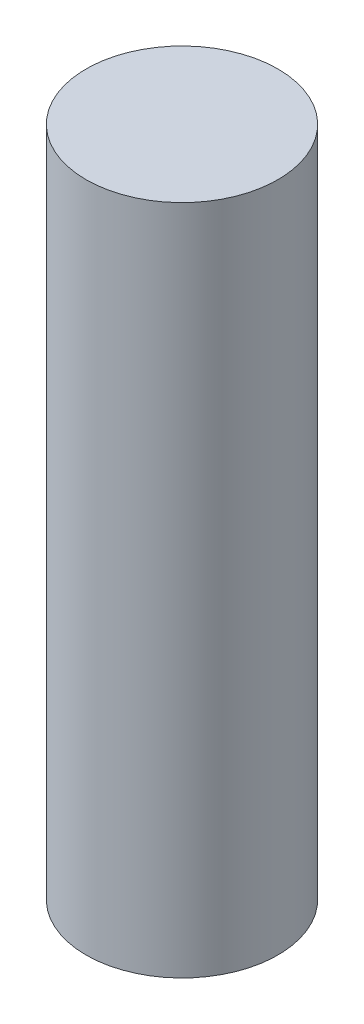
ISO-10303-21;
HEADER;
FILE_DESCRIPTION(('STEP AP214'),'2;1');
FILE_NAME('part.step','',(''),(''),'','','');
FILE_SCHEMA(('AUTOMOTIVE_DESIGN { 1 0 10303 214 1 1 1 1 }'));
ENDSEC;
DATA;
#1=APPLICATION_CONTEXT('core data for automotive mechanical design processes');
#2=APPLICATION_PROTOCOL_DEFINITION('international standard','automotive_design',2000,#1);
#3=PRODUCT_CONTEXT('',#1,'mechanical');
#4=PRODUCT('Part','Part','',(#3));
#5=PRODUCT_RELATED_PRODUCT_CATEGORY('part','',(#4));
#6=PRODUCT_DEFINITION_FORMATION('','',#4);
#7=PRODUCT_DEFINITION_CONTEXT('part definition',#1,'design');
#8=PRODUCT_DEFINITION('design','',#6,#7);
#9=PRODUCT_DEFINITION_SHAPE('','',#8);
#10=(LENGTH_UNIT() NAMED_UNIT(*) SI_UNIT(.MILLI.,.METRE.));
#11=(NAMED_UNIT(*) PLANE_ANGLE_UNIT() SI_UNIT($,.RADIAN.));
#12=(NAMED_UNIT(*) SI_UNIT($,.STERADIAN.) SOLID_ANGLE_UNIT());
#13=UNCERTAINTY_MEASURE_WITH_UNIT(LENGTH_MEASURE(1.E-05),#10,'distance_accuracy_value','');
#14=(GEOMETRIC_REPRESENTATION_CONTEXT(3) GLOBAL_UNCERTAINTY_ASSIGNED_CONTEXT((#13)) GLOBAL_UNIT_ASSIGNED_CONTEXT((#10,
#11,#12)) REPRESENTATION_CONTEXT('',''));
#15=CARTESIAN_POINT('',(0.,0.,0.));
#16=DIRECTION('',(0.,0.,1.));
#17=DIRECTION('',(1.,0.,0.));
#18=AXIS2_PLACEMENT_3D('',#15,#16,#17);
#19=CARTESIAN_POINT('',(0.,17.5,0.));
#20=DIRECTION('',(0.,-1.,0.));
#21=DIRECTION('',(0.,0.,-1.));
#22=AXIS2_PLACEMENT_3D('',#19,#20,#21);
#23=CYLINDRICAL_SURFACE('',#22,5.);
#24=CARTESIAN_POINT('',(0.,17.5,0.));
#25=DIRECTION('',(0.,1.,0.));
#26=DIRECTION('',(0.,0.,1.));
#27=AXIS2_PLACEMENT_3D('',#24,#25,#26);
#28=CIRCLE('',#27,5.);
#29=CARTESIAN_POINT('',(0.,17.5,5.));
#30=VERTEX_POINT('',#29);
#31=EDGE_CURVE('E10',#30,#30,#28,.T.);
#32=ORIENTED_EDGE('',*,*,#31,.F.);
#33=EDGE_LOOP('',(#32));
#34=FACE_BOUND('',#33,.T.);
#35=CARTESIAN_POINT('',(0.,-17.5,0.));
#36=DIRECTION('',(0.,1.,0.));
#37=DIRECTION('',(0.,0.,1.));
#38=AXIS2_PLACEMENT_3D('',#35,#36,#37);
#39=CIRCLE('',#38,5.);
#40=CARTESIAN_POINT('',(0.,-17.5,5.));
#41=VERTEX_POINT('',#40);
#42=EDGE_CURVE('E40',#41,#41,#39,.T.);
#43=ORIENTED_EDGE('',*,*,#42,.T.);
#44=EDGE_LOOP('',(#43));
#45=FACE_BOUND('',#44,.T.);
#46=ADVANCED_FACE('F37',(#34,#45),#23,.T.);
#47=CARTESIAN_POINT('',(0.,17.5,0.));
#48=DIRECTION('',(0.,1.,0.));
#49=DIRECTION('',(0.,0.,1.));
#50=AXIS2_PLACEMENT_3D('',#47,#48,#49);
#51=PLANE('',#50);
#52=ORIENTED_EDGE('',*,*,#31,.T.);
#53=EDGE_LOOP('',(#52));
#54=FACE_BOUND('',#53,.T.);
#55=ADVANCED_FACE('F52',(#54),#51,.T.);
#56=CARTESIAN_POINT('',(0.,-17.5,0.));
#57=DIRECTION('',(0.,1.,0.));
#58=DIRECTION('',(0.,0.,1.));
#59=AXIS2_PLACEMENT_3D('',#56,#57,#58);
#60=PLANE('',#59);
#61=ORIENTED_EDGE('',*,*,#42,.F.);
#62=EDGE_LOOP('',(#61));
#63=FACE_BOUND('',#62,.T.);
#64=ADVANCED_FACE('F50',(#63),#60,.F.);
#65=CLOSED_SHELL('',(#46,#55,#64));
#66=MANIFOLD_SOLID_BREP('B2',#65);
#67=ADVANCED_BREP_SHAPE_REPRESENTATION('',(#18,#66),#14);
#68=SHAPE_DEFINITION_REPRESENTATION(#9,#67);
ENDSEC;
END-ISO-10303-21;
